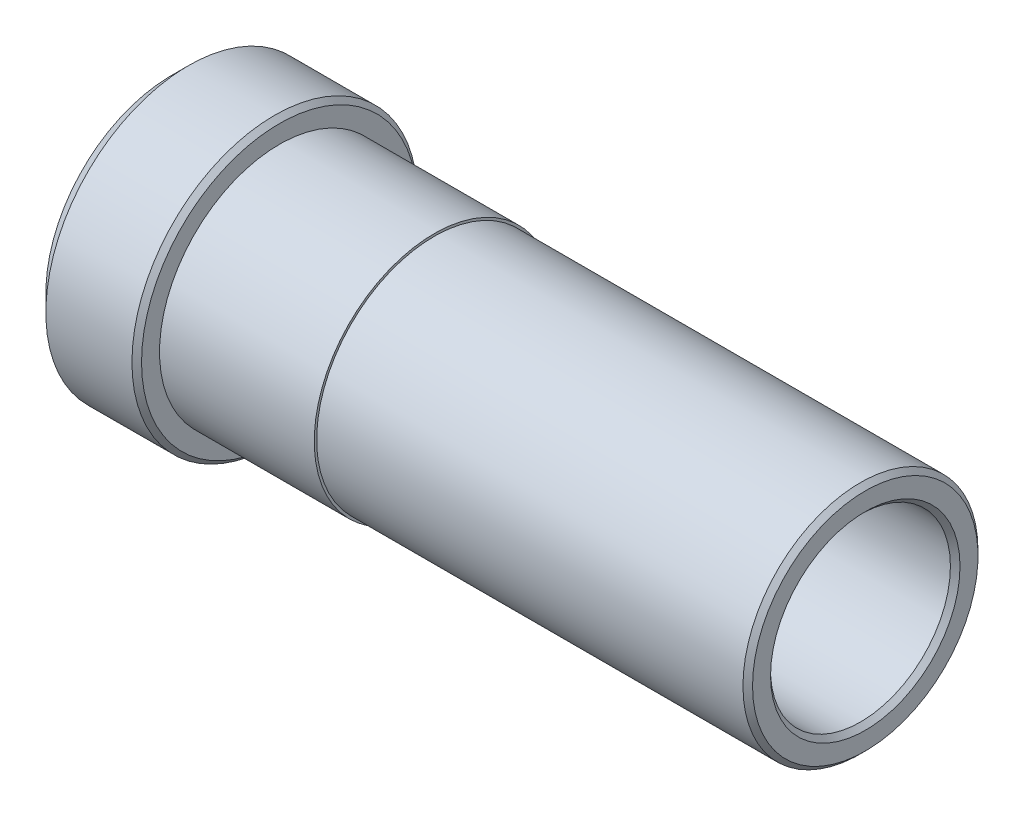
ISO-10303-21;
HEADER;
FILE_DESCRIPTION(('STEP AP214'),'2;1');
FILE_NAME('part.step','',(''),(''),'','','');
FILE_SCHEMA(('AUTOMOTIVE_DESIGN { 1 0 10303 214 1 1 1 1 }'));
ENDSEC;
DATA;
#1=APPLICATION_CONTEXT('core data for automotive mechanical design processes');
#2=APPLICATION_PROTOCOL_DEFINITION('international standard','automotive_design',2000,#1);
#3=PRODUCT_CONTEXT('',#1,'mechanical');
#4=PRODUCT('Part','Part','',(#3));
#5=PRODUCT_RELATED_PRODUCT_CATEGORY('part','',(#4));
#6=PRODUCT_DEFINITION_FORMATION('','',#4);
#7=PRODUCT_DEFINITION_CONTEXT('part definition',#1,'design');
#8=PRODUCT_DEFINITION('design','',#6,#7);
#9=PRODUCT_DEFINITION_SHAPE('','',#8);
#10=(LENGTH_UNIT() NAMED_UNIT(*) SI_UNIT(.MILLI.,.METRE.));
#11=(NAMED_UNIT(*) PLANE_ANGLE_UNIT() SI_UNIT($,.RADIAN.));
#12=(NAMED_UNIT(*) SI_UNIT($,.STERADIAN.) SOLID_ANGLE_UNIT());
#13=UNCERTAINTY_MEASURE_WITH_UNIT(LENGTH_MEASURE(1.E-05),#10,'distance_accuracy_value','');
#14=(GEOMETRIC_REPRESENTATION_CONTEXT(3) GLOBAL_UNCERTAINTY_ASSIGNED_CONTEXT((#13)) GLOBAL_UNIT_ASSIGNED_CONTEXT((#10,
#11,#12)) REPRESENTATION_CONTEXT('',''));
#15=CARTESIAN_POINT('',(0.,0.,0.));
#16=DIRECTION('',(0.,0.,1.));
#17=DIRECTION('',(1.,0.,0.));
#18=AXIS2_PLACEMENT_3D('',#15,#16,#17);
#19=CARTESIAN_POINT('',(0.,0.,0.));
#20=DIRECTION('',(1.,0.,0.));
#21=DIRECTION('',(0.,0.,-1.));
#22=AXIS2_PLACEMENT_3D('',#19,#20,#21);
#23=CYLINDRICAL_SURFACE('',#22,6.35);
#24=CARTESIAN_POINT('',(-31.01975,0.,0.));
#25=DIRECTION('',(1.,0.,0.));
#26=DIRECTION('',(0.,0.,-1.));
#27=AXIS2_PLACEMENT_3D('',#24,#25,#26);
#28=CIRCLE('',#27,6.35);
#29=CARTESIAN_POINT('',(-31.01975,0.,-6.35));
#30=VERTEX_POINT('',#29);
#31=EDGE_CURVE('E18',#30,#30,#28,.F.);
#32=ORIENTED_EDGE('',*,*,#31,.F.);
#33=EDGE_LOOP('',(#32));
#34=FACE_BOUND('',#33,.T.);
#35=CARTESIAN_POINT('',(-22.82825,0.,0.));
#36=DIRECTION('',(1.,0.,0.));
#37=DIRECTION('',(0.,0.,-1.));
#38=AXIS2_PLACEMENT_3D('',#35,#36,#37);
#39=CIRCLE('',#38,6.35);
#40=CARTESIAN_POINT('',(-22.82825,0.,-6.35));
#41=VERTEX_POINT('',#40);
#42=EDGE_CURVE('E55',#41,#41,#39,.T.);
#43=ORIENTED_EDGE('',*,*,#42,.F.);
#44=EDGE_LOOP('',(#43));
#45=FACE_BOUND('',#44,.T.);
#46=ADVANCED_FACE('F15',(#34,#45),#23,.T.);
#47=CARTESIAN_POINT('',(-31.01975,7.5565,0.));
#48=DIRECTION('',(1.,0.,0.));
#49=DIRECTION('',(0.,0.,-1.));
#50=AXIS2_PLACEMENT_3D('',#47,#48,#49);
#51=PLANE('',#50);
#52=ORIENTED_EDGE('',*,*,#31,.T.);
#53=EDGE_LOOP('',(#52));
#54=FACE_BOUND('',#53,.T.);
#55=CARTESIAN_POINT('',(-31.01975,0.,0.));
#56=DIRECTION('',(-1.,0.,0.));
#57=DIRECTION('',(0.,0.,1.));
#58=AXIS2_PLACEMENT_3D('',#55,#56,#57);
#59=CIRCLE('',#58,7.30249999999999);
#60=CARTESIAN_POINT('',(-31.01975,0.,7.30249999999999));
#61=VERTEX_POINT('',#60);
#62=EDGE_CURVE('E53',#61,#61,#59,.T.);
#63=ORIENTED_EDGE('',*,*,#62,.F.);
#64=EDGE_LOOP('',(#63));
#65=FACE_BOUND('',#64,.T.);
#66=ADVANCED_FACE('F62',(#54,#65),#51,.T.);
#67=CARTESIAN_POINT('',(-22.82825,6.35,0.));
#68=DIRECTION('',(1.,0.,0.));
#69=DIRECTION('',(0.,0.,-1.));
#70=AXIS2_PLACEMENT_3D('',#67,#68,#69);
#71=PLANE('',#70);
#72=CARTESIAN_POINT('',(-22.82825,0.,0.));
#73=DIRECTION('',(1.,0.,0.));
#74=DIRECTION('',(0.,0.,-1.));
#75=AXIS2_PLACEMENT_3D('',#72,#73,#74);
#76=CIRCLE('',#75,6.223);
#77=CARTESIAN_POINT('',(-22.82825,0.,-6.223));
#78=VERTEX_POINT('',#77);
#79=EDGE_CURVE('E40',#78,#78,#76,.T.);
#80=ORIENTED_EDGE('',*,*,#79,.F.);
#81=EDGE_LOOP('',(#80));
#82=FACE_BOUND('',#81,.T.);
#83=ORIENTED_EDGE('',*,*,#42,.T.);
#84=EDGE_LOOP('',(#83));
#85=FACE_BOUND('',#84,.T.);
#86=ADVANCED_FACE('F71',(#82,#85),#71,.T.);
#87=CARTESIAN_POINT('',(-31.27375,0.,0.));
#88=DIRECTION('',(-1.,0.,0.));
#89=DIRECTION('',(0.,0.,1.));
#90=AXIS2_PLACEMENT_3D('',#87,#88,#89);
#91=CONICAL_SURFACE('',#90,7.5565,0.785398163397424);
#92=CARTESIAN_POINT('',(-31.27375,0.,0.));
#93=DIRECTION('',(1.,0.,0.));
#94=DIRECTION('',(0.,0.,-1.));
#95=AXIS2_PLACEMENT_3D('',#92,#93,#94);
#96=CIRCLE('',#95,7.5565);
#97=CARTESIAN_POINT('',(-31.27375,0.,-7.5565));
#98=VERTEX_POINT('',#97);
#99=EDGE_CURVE('E37',#98,#98,#96,.F.);
#100=ORIENTED_EDGE('',*,*,#99,.F.);
#101=EDGE_LOOP('',(#100));
#102=FACE_BOUND('',#101,.T.);
#103=ORIENTED_EDGE('',*,*,#62,.T.);
#104=EDGE_LOOP('',(#103));
#105=FACE_BOUND('',#104,.T.);
#106=ADVANCED_FACE('F111',(#102,#105),#91,.T.);
#107=CARTESIAN_POINT('',(0.,0.,0.));
#108=DIRECTION('',(1.,0.,0.));
#109=DIRECTION('',(0.,0.,-1.));
#110=AXIS2_PLACEMENT_3D('',#107,#108,#109);
#111=CYLINDRICAL_SURFACE('',#110,6.223);
#112=CARTESIAN_POINT('',(-0.253999999983989,0.,0.));
#113=DIRECTION('',(-1.,0.,0.));
#114=DIRECTION('',(0.,0.,1.));
#115=AXIS2_PLACEMENT_3D('',#112,#113,#114);
#116=CIRCLE('',#115,6.22299999992038);
#117=CARTESIAN_POINT('',(-0.253999999983989,0.,6.22299999992038));
#118=VERTEX_POINT('',#117);
#119=EDGE_CURVE('E34',#118,#118,#116,.F.);
#120=ORIENTED_EDGE('',*,*,#119,.F.);
#121=EDGE_LOOP('',(#120));
#122=FACE_BOUND('',#121,.T.);
#123=ORIENTED_EDGE('',*,*,#79,.T.);
#124=EDGE_LOOP('',(#123));
#125=FACE_BOUND('',#124,.T.);
#126=ADVANCED_FACE('F107',(#122,#125),#111,.T.);
#127=CARTESIAN_POINT('',(0.,0.,0.));
#128=DIRECTION('',(1.,0.,0.));
#129=DIRECTION('',(0.,0.,-1.));
#130=AXIS2_PLACEMENT_3D('',#127,#128,#129);
#131=CYLINDRICAL_SURFACE('',#130,7.5565);
#132=ORIENTED_EDGE('',*,*,#99,.T.);
#133=EDGE_LOOP('',(#132));
#134=FACE_BOUND('',#133,.T.);
#135=CARTESIAN_POINT('',(-35.83305,0.,0.));
#136=DIRECTION('',(1.,0.,0.));
#137=DIRECTION('',(0.,0.,-1.));
#138=AXIS2_PLACEMENT_3D('',#135,#136,#137);
#139=CIRCLE('',#138,7.5565);
#140=CARTESIAN_POINT('',(-35.83305,0.,-7.5565));
#141=VERTEX_POINT('',#140);
#142=EDGE_CURVE('E30',#141,#141,#139,.F.);
#143=ORIENTED_EDGE('',*,*,#142,.F.);
#144=EDGE_LOOP('',(#143));
#145=FACE_BOUND('',#144,.T.);
#146=ADVANCED_FACE('F103',(#134,#145),#131,.T.);
#147=CARTESIAN_POINT('',(-0.253999999983989,0.,0.));
#148=DIRECTION('',(-1.,0.,0.));
#149=DIRECTION('',(0.,0.,1.));
#150=AXIS2_PLACEMENT_3D('',#147,#148,#149);
#151=CONICAL_SURFACE('',#150,6.22299999992038,0.785398163397448);
#152=ORIENTED_EDGE('',*,*,#119,.T.);
#153=EDGE_LOOP('',(#152));
#154=FACE_BOUND('',#153,.T.);
#155=CARTESIAN_POINT('',(0.,0.,0.));
#156=DIRECTION('',(-1.,0.,0.));
#157=DIRECTION('',(0.,0.,1.));
#158=AXIS2_PLACEMENT_3D('',#155,#156,#157);
#159=CIRCLE('',#158,5.96899999993639);
#160=CARTESIAN_POINT('',(0.,0.,5.96899999993639));
#161=VERTEX_POINT('',#160);
#162=EDGE_CURVE('E33',#161,#161,#159,.F.);
#163=ORIENTED_EDGE('',*,*,#162,.F.);
#164=EDGE_LOOP('',(#163));
#165=FACE_BOUND('',#164,.T.);
#166=ADVANCED_FACE('F99',(#154,#165),#151,.T.);
#167=CARTESIAN_POINT('',(-35.83305,0.,0.));
#168=DIRECTION('',(1.,0.,0.));
#169=DIRECTION('',(0.,0.,-1.));
#170=AXIS2_PLACEMENT_3D('',#167,#168,#169);
#171=CONICAL_SURFACE('',#170,7.5565,0.785398163397449);
#172=ORIENTED_EDGE('',*,*,#142,.T.);
#173=EDGE_LOOP('',(#172));
#174=FACE_BOUND('',#173,.T.);
#175=CARTESIAN_POINT('',(-36.72205,0.,0.));
#176=DIRECTION('',(1.,0.,0.));
#177=DIRECTION('',(0.,0.,-1.));
#178=AXIS2_PLACEMENT_3D('',#175,#176,#177);
#179=CIRCLE('',#178,6.66749999999999);
#180=CARTESIAN_POINT('',(-36.72205,0.,-6.66749999999999));
#181=VERTEX_POINT('',#180);
#182=EDGE_CURVE('E46',#181,#181,#179,.F.);
#183=ORIENTED_EDGE('',*,*,#182,.F.);
#184=EDGE_LOOP('',(#183));
#185=FACE_BOUND('',#184,.T.);
#186=ADVANCED_FACE('F95',(#174,#185),#171,.T.);
#187=CARTESIAN_POINT('',(0.,6.22299999999999,0.));
#188=DIRECTION('',(1.,0.,0.));
#189=DIRECTION('',(0.,0.,-1.));
#190=AXIS2_PLACEMENT_3D('',#187,#188,#189);
#191=PLANE('',#190);
#192=CARTESIAN_POINT('',(0.,0.,0.));
#193=DIRECTION('',(1.,0.,0.));
#194=DIRECTION('',(0.,0.,-1.));
#195=AXIS2_PLACEMENT_3D('',#192,#193,#194);
#196=CIRCLE('',#195,5.01650000001064);
#197=CARTESIAN_POINT('',(0.,0.,-5.01650000001064));
#198=VERTEX_POINT('',#197);
#199=EDGE_CURVE('E43',#198,#198,#196,.F.);
#200=ORIENTED_EDGE('',*,*,#199,.T.);
#201=EDGE_LOOP('',(#200));
#202=FACE_BOUND('',#201,.T.);
#203=ORIENTED_EDGE('',*,*,#162,.T.);
#204=EDGE_LOOP('',(#203));
#205=FACE_BOUND('',#204,.T.);
#206=ADVANCED_FACE('F91',(#202,#205),#191,.T.);
#207=CARTESIAN_POINT('',(-36.72205,4.7625,0.));
#208=DIRECTION('',(-1.,0.,0.));
#209=DIRECTION('',(0.,0.,1.));
#210=AXIS2_PLACEMENT_3D('',#207,#208,#209);
#211=PLANE('',#210);
#212=ORIENTED_EDGE('',*,*,#182,.T.);
#213=EDGE_LOOP('',(#212));
#214=FACE_BOUND('',#213,.T.);
#215=CARTESIAN_POINT('',(-36.7220500000371,0.,0.));
#216=DIRECTION('',(-1.,0.,0.));
#217=DIRECTION('',(0.,0.,1.));
#218=AXIS2_PLACEMENT_3D('',#215,#216,#217);
#219=CIRCLE('',#218,5.01650000006748);
#220=CARTESIAN_POINT('',(-36.7220500000371,0.,5.01650000006748));
#221=VERTEX_POINT('',#220);
#222=EDGE_CURVE('E27',#221,#221,#219,.F.);
#223=ORIENTED_EDGE('',*,*,#222,.T.);
#224=EDGE_LOOP('',(#223));
#225=FACE_BOUND('',#224,.T.);
#226=ADVANCED_FACE('F87',(#214,#225),#211,.T.);
#227=CARTESIAN_POINT('',(-5.6843418860808E-11,0.,0.));
#228=DIRECTION('',(1.,0.,0.));
#229=DIRECTION('',(0.,0.,-1.));
#230=AXIS2_PLACEMENT_3D('',#227,#228,#229);
#231=CONICAL_SURFACE('',#230,5.01649999995379,0.785398163397448);
#232=ORIENTED_EDGE('',*,*,#199,.F.);
#233=EDGE_LOOP('',(#232));
#234=FACE_BOUND('',#233,.T.);
#235=CARTESIAN_POINT('',(-0.253999999999995,0.,0.));
#236=DIRECTION('',(1.,0.,0.));
#237=DIRECTION('',(0.,0.,-1.));
#238=AXIS2_PLACEMENT_3D('',#235,#236,#237);
#239=CIRCLE('',#238,4.7625);
#240=CARTESIAN_POINT('',(-0.253999999999995,0.,-4.7625));
#241=VERTEX_POINT('',#240);
#242=EDGE_CURVE('E22',#241,#241,#239,.F.);
#243=ORIENTED_EDGE('',*,*,#242,.T.);
#244=EDGE_LOOP('',(#243));
#245=FACE_BOUND('',#244,.T.);
#246=ADVANCED_FACE('F80',(#234,#245),#231,.F.);
#247=CARTESIAN_POINT('',(-36.7220500000371,0.,0.));
#248=DIRECTION('',(-1.,0.,0.));
#249=DIRECTION('',(0.,0.,1.));
#250=AXIS2_PLACEMENT_3D('',#247,#248,#249);
#251=CONICAL_SURFACE('',#250,5.01650000006748,0.785398163397448);
#252=CARTESIAN_POINT('',(-36.46805,0.,0.));
#253=DIRECTION('',(1.,0.,0.));
#254=DIRECTION('',(0.,0.,-1.));
#255=AXIS2_PLACEMENT_3D('',#252,#253,#254);
#256=CIRCLE('',#255,4.7625);
#257=CARTESIAN_POINT('',(-36.46805,0.,-4.7625));
#258=VERTEX_POINT('',#257);
#259=EDGE_CURVE('E10',#258,#258,#256,.T.);
#260=ORIENTED_EDGE('',*,*,#259,.T.);
#261=EDGE_LOOP('',(#260));
#262=FACE_BOUND('',#261,.T.);
#263=ORIENTED_EDGE('',*,*,#222,.F.);
#264=EDGE_LOOP('',(#263));
#265=FACE_BOUND('',#264,.T.);
#266=ADVANCED_FACE('F74',(#262,#265),#251,.F.);
#267=CARTESIAN_POINT('',(0.,0.,0.));
#268=DIRECTION('',(1.,0.,0.));
#269=DIRECTION('',(0.,0.,-1.));
#270=AXIS2_PLACEMENT_3D('',#267,#268,#269);
#271=CYLINDRICAL_SURFACE('',#270,4.7625);
#272=ORIENTED_EDGE('',*,*,#242,.F.);
#273=EDGE_LOOP('',(#272));
#274=FACE_BOUND('',#273,.T.);
#275=ORIENTED_EDGE('',*,*,#259,.F.);
#276=EDGE_LOOP('',(#275));
#277=FACE_BOUND('',#276,.T.);
#278=ADVANCED_FACE('F72',(#274,#277),#271,.F.);
#279=CLOSED_SHELL('',(#46,#66,#86,#106,#126,#146,#166,#186,#206,#226,#246,#266,#278));
#280=MANIFOLD_SOLID_BREP('B1',#279);
#281=ADVANCED_BREP_SHAPE_REPRESENTATION('',(#18,#280),#14);
#282=SHAPE_DEFINITION_REPRESENTATION(#9,#281);
ENDSEC;
END-ISO-10303-21;
